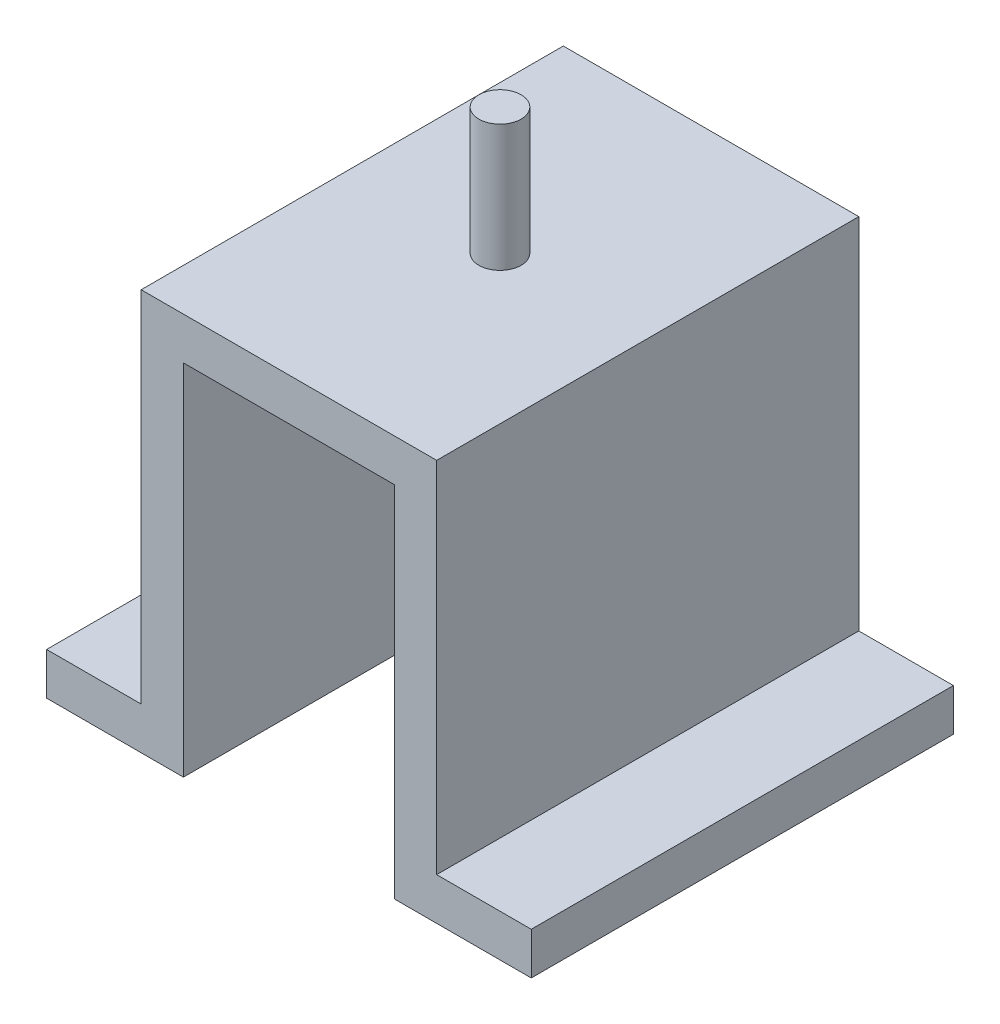
ISO-10303-21;
HEADER;
FILE_DESCRIPTION(('STEP AP214'),'2;1');
FILE_NAME('part.step','',(''),(''),'','','');
FILE_SCHEMA(('AUTOMOTIVE_DESIGN { 1 0 10303 214 1 1 1 1 }'));
ENDSEC;
DATA;
#1=APPLICATION_CONTEXT('core data for automotive mechanical design processes');
#2=APPLICATION_PROTOCOL_DEFINITION('international standard','automotive_design',2000,#1);
#3=PRODUCT_CONTEXT('',#1,'mechanical');
#4=PRODUCT('Part','Part','',(#3));
#5=PRODUCT_RELATED_PRODUCT_CATEGORY('part','',(#4));
#6=PRODUCT_DEFINITION_FORMATION('','',#4);
#7=PRODUCT_DEFINITION_CONTEXT('part definition',#1,'design');
#8=PRODUCT_DEFINITION('design','',#6,#7);
#9=PRODUCT_DEFINITION_SHAPE('','',#8);
#10=(LENGTH_UNIT() NAMED_UNIT(*) SI_UNIT(.MILLI.,.METRE.));
#11=(NAMED_UNIT(*) PLANE_ANGLE_UNIT() SI_UNIT($,.RADIAN.));
#12=(NAMED_UNIT(*) SI_UNIT($,.STERADIAN.) SOLID_ANGLE_UNIT());
#13=UNCERTAINTY_MEASURE_WITH_UNIT(LENGTH_MEASURE(1.E-05),#10,'distance_accuracy_value','');
#14=(GEOMETRIC_REPRESENTATION_CONTEXT(3) GLOBAL_UNCERTAINTY_ASSIGNED_CONTEXT((#13)) GLOBAL_UNIT_ASSIGNED_CONTEXT((#10,
#11,#12)) REPRESENTATION_CONTEXT('',''));
#15=CARTESIAN_POINT('',(0.,0.,0.));
#16=DIRECTION('',(0.,0.,1.));
#17=DIRECTION('',(1.,0.,0.));
#18=AXIS2_PLACEMENT_3D('',#15,#16,#17);
#19=CARTESIAN_POINT('',(0.,49.5144538231221,0.));
#20=DIRECTION('',(0.,1.,0.));
#21=DIRECTION('',(-1.,0.,0.));
#22=AXIS2_PLACEMENT_3D('',#19,#20,#21);
#23=PLANE('',#22);
#24=DIRECTION('',(0.,0.,1.));
#25=VECTOR('',#24,1.);
#26=CARTESIAN_POINT('',(-35.,49.5144538231221,0.));
#27=LINE('',#26,#25);
#28=CARTESIAN_POINT('',(-35.,49.5144538231221,0.));
#29=VERTEX_POINT('',#28);
#30=CARTESIAN_POINT('',(-35.,49.5144538231221,100.));
#31=VERTEX_POINT('',#30);
#32=EDGE_CURVE('E165',#29,#31,#27,.T.);
#33=ORIENTED_EDGE('',*,*,#32,.T.);
#34=DIRECTION('',(1.,0.,0.));
#35=VECTOR('',#34,1.);
#36=CARTESIAN_POINT('',(-35.,49.5144538231221,100.));
#37=LINE('',#36,#35);
#38=CARTESIAN_POINT('',(35.,49.5144538231221,100.));
#39=VERTEX_POINT('',#38);
#40=EDGE_CURVE('E168',#31,#39,#37,.T.);
#41=ORIENTED_EDGE('',*,*,#40,.T.);
#42=DIRECTION('',(0.,0.,-1.));
#43=VECTOR('',#42,1.);
#44=CARTESIAN_POINT('',(35.,49.5144538231221,0.));
#45=LINE('',#44,#43);
#46=CARTESIAN_POINT('',(35.,49.5144538231221,0.));
#47=VERTEX_POINT('',#46);
#48=EDGE_CURVE('E171',#39,#47,#45,.T.);
#49=ORIENTED_EDGE('',*,*,#48,.T.);
#50=DIRECTION('',(-1.,0.,0.));
#51=VECTOR('',#50,1.);
#52=CARTESIAN_POINT('',(-35.,49.5144538231221,0.));
#53=LINE('',#52,#51);
#54=EDGE_CURVE('E174',#47,#29,#53,.T.);
#55=ORIENTED_EDGE('',*,*,#54,.T.);
#56=EDGE_LOOP('',(#33,#41,#49,#55));
#57=FACE_BOUND('',#56,.T.);
#58=CARTESIAN_POINT('',(0.,49.5144538231221,50.));
#59=DIRECTION('',(0.,1.,0.));
#60=DIRECTION('',(-1.,0.,0.));
#61=AXIS2_PLACEMENT_3D('',#58,#59,#60);
#62=CIRCLE('',#61,5.);
#63=CARTESIAN_POINT('',(-5.00000000000003,49.5144538231221,50.));
#64=VERTEX_POINT('',#63);
#65=EDGE_CURVE('E413',#64,#64,#62,.T.);
#66=ORIENTED_EDGE('',*,*,#65,.F.);
#67=EDGE_LOOP('',(#66));
#68=FACE_BOUND('',#67,.T.);
#69=ADVANCED_FACE('F33',(#57,#68),#23,.T.);
#70=CARTESIAN_POINT('',(0.,39.5144538231221,0.));
#71=DIRECTION('',(0.,1.,0.));
#72=DIRECTION('',(-1.,0.,0.));
#73=AXIS2_PLACEMENT_3D('',#70,#71,#72);
#74=PLANE('',#73);
#75=DIRECTION('',(0.,0.,-1.));
#76=VECTOR('',#75,1.);
#77=CARTESIAN_POINT('',(-25.,39.5144538231221,100.));
#78=LINE('',#77,#76);
#79=CARTESIAN_POINT('',(-25.,39.5144538231221,100.));
#80=VERTEX_POINT('',#79);
#81=CARTESIAN_POINT('',(-25.,39.5144538231221,0.));
#82=VERTEX_POINT('',#81);
#83=EDGE_CURVE('E161',#80,#82,#78,.T.);
#84=ORIENTED_EDGE('',*,*,#83,.T.);
#85=DIRECTION('',(-1.,0.,0.));
#86=VECTOR('',#85,1.);
#87=CARTESIAN_POINT('',(-35.,39.5144538231221,0.));
#88=LINE('',#87,#86);
#89=CARTESIAN_POINT('',(25.,39.5144538231221,0.));
#90=VERTEX_POINT('',#89);
#91=EDGE_CURVE('E81',#90,#82,#88,.T.);
#92=ORIENTED_EDGE('',*,*,#91,.F.);
#93=DIRECTION('',(0.,0.,-1.));
#94=VECTOR('',#93,1.);
#95=CARTESIAN_POINT('',(25.,39.5144538231221,100.));
#96=LINE('',#95,#94);
#97=CARTESIAN_POINT('',(25.,39.5144538231221,100.));
#98=VERTEX_POINT('',#97);
#99=EDGE_CURVE('E191',#98,#90,#96,.T.);
#100=ORIENTED_EDGE('',*,*,#99,.F.);
#101=DIRECTION('',(1.,0.,0.));
#102=VECTOR('',#101,1.);
#103=CARTESIAN_POINT('',(-35.,39.5144538231221,100.));
#104=LINE('',#103,#102);
#105=EDGE_CURVE('E37',#80,#98,#104,.T.);
#106=ORIENTED_EDGE('',*,*,#105,.F.);
#107=EDGE_LOOP('',(#84,#92,#100,#106));
#108=FACE_BOUND('',#107,.T.);
#109=ADVANCED_FACE('F259',(#108),#74,.F.);
#110=CARTESIAN_POINT('',(25.,39.5144538231221,100.));
#111=DIRECTION('',(1.,0.,0.));
#112=DIRECTION('',(0.,1.,0.));
#113=AXIS2_PLACEMENT_3D('',#110,#111,#112);
#114=PLANE('',#113);
#115=DIRECTION('',(0.,-1.,0.));
#116=VECTOR('',#115,1.);
#117=CARTESIAN_POINT('',(25.,39.5144538231221,0.));
#118=LINE('',#117,#116);
#119=CARTESIAN_POINT('',(25.,-45.4855461768779,0.));
#120=VERTEX_POINT('',#119);
#121=EDGE_CURVE('E195',#90,#120,#118,.T.);
#122=ORIENTED_EDGE('',*,*,#121,.T.);
#123=DIRECTION('',(0.,0.,-1.));
#124=VECTOR('',#123,1.);
#125=CARTESIAN_POINT('',(25.,-45.4855461768779,100.));
#126=LINE('',#125,#124);
#127=CARTESIAN_POINT('',(25.,-45.4855461768779,100.));
#128=VERTEX_POINT('',#127);
#129=EDGE_CURVE('E11',#128,#120,#126,.T.);
#130=ORIENTED_EDGE('',*,*,#129,.F.);
#131=DIRECTION('',(0.,-1.,0.));
#132=VECTOR('',#131,1.);
#133=CARTESIAN_POINT('',(25.,39.5144538231221,100.));
#134=LINE('',#133,#132);
#135=EDGE_CURVE('E186',#98,#128,#134,.T.);
#136=ORIENTED_EDGE('',*,*,#135,.F.);
#137=ORIENTED_EDGE('',*,*,#99,.T.);
#138=EDGE_LOOP('',(#122,#130,#136,#137));
#139=FACE_BOUND('',#138,.T.);
#140=ADVANCED_FACE('F35',(#139),#114,.F.);
#141=CARTESIAN_POINT('',(57.4040103991189,-45.4855461768779,100.));
#142=DIRECTION('',(0.,1.,0.));
#143=DIRECTION('',(0.,0.,1.));
#144=AXIS2_PLACEMENT_3D('',#141,#142,#143);
#145=PLANE('',#144);
#146=DIRECTION('',(1.,0.,0.));
#147=VECTOR('',#146,1.);
#148=CARTESIAN_POINT('',(57.4040103991189,-45.4855461768779,0.));
#149=LINE('',#148,#147);
#150=CARTESIAN_POINT('',(57.4040103991189,-45.4855461768779,0.));
#151=VERTEX_POINT('',#150);
#152=EDGE_CURVE('E192',#120,#151,#149,.T.);
#153=ORIENTED_EDGE('',*,*,#152,.T.);
#154=DIRECTION('',(0.,0.,-1.));
#155=VECTOR('',#154,1.);
#156=CARTESIAN_POINT('',(57.4040103991189,-45.4855461768779,100.));
#157=LINE('',#156,#155);
#158=CARTESIAN_POINT('',(57.4040103991189,-45.4855461768779,100.));
#159=VERTEX_POINT('',#158);
#160=EDGE_CURVE('E44',#159,#151,#157,.T.);
#161=ORIENTED_EDGE('',*,*,#160,.F.);
#162=DIRECTION('',(1.,0.,0.));
#163=VECTOR('',#162,1.);
#164=CARTESIAN_POINT('',(57.4040103991189,-45.4855461768779,100.));
#165=LINE('',#164,#163);
#166=EDGE_CURVE('E88',#128,#159,#165,.T.);
#167=ORIENTED_EDGE('',*,*,#166,.F.);
#168=ORIENTED_EDGE('',*,*,#129,.T.);
#169=EDGE_LOOP('',(#153,#161,#167,#168));
#170=FACE_BOUND('',#169,.T.);
#171=ADVANCED_FACE('F217',(#170),#145,.F.);
#172=CARTESIAN_POINT('',(57.4040103991189,-35.4855461768779,100.));
#173=DIRECTION('',(-1.,0.,0.));
#174=DIRECTION('',(0.,-1.,0.));
#175=AXIS2_PLACEMENT_3D('',#172,#173,#174);
#176=PLANE('',#175);
#177=DIRECTION('',(0.,1.,0.));
#178=VECTOR('',#177,1.);
#179=CARTESIAN_POINT('',(57.4040103991189,-35.4855461768779,0.));
#180=LINE('',#179,#178);
#181=CARTESIAN_POINT('',(57.4040103991189,-35.4855461768779,0.));
#182=VERTEX_POINT('',#181);
#183=EDGE_CURVE('E194',#151,#182,#180,.T.);
#184=ORIENTED_EDGE('',*,*,#183,.T.);
#185=DIRECTION('',(0.,0.,-1.));
#186=VECTOR('',#185,1.);
#187=CARTESIAN_POINT('',(57.4040103991189,-35.4855461768779,100.));
#188=LINE('',#187,#186);
#189=CARTESIAN_POINT('',(57.4040103991189,-35.4855461768779,100.));
#190=VERTEX_POINT('',#189);
#191=EDGE_CURVE('E225',#190,#182,#188,.T.);
#192=ORIENTED_EDGE('',*,*,#191,.F.);
#193=DIRECTION('',(0.,1.,0.));
#194=VECTOR('',#193,1.);
#195=CARTESIAN_POINT('',(57.4040103991189,-35.4855461768779,100.));
#196=LINE('',#195,#194);
#197=EDGE_CURVE('E185',#159,#190,#196,.T.);
#198=ORIENTED_EDGE('',*,*,#197,.F.);
#199=ORIENTED_EDGE('',*,*,#160,.T.);
#200=EDGE_LOOP('',(#184,#192,#198,#199));
#201=FACE_BOUND('',#200,.T.);
#202=ADVANCED_FACE('F223',(#201),#176,.F.);
#203=CARTESIAN_POINT('',(35.,-35.4855461768779,100.));
#204=DIRECTION('',(0.,-1.,0.));
#205=DIRECTION('',(0.,0.,-1.));
#206=AXIS2_PLACEMENT_3D('',#203,#204,#205);
#207=PLANE('',#206);
#208=DIRECTION('',(-1.,0.,0.));
#209=VECTOR('',#208,1.);
#210=CARTESIAN_POINT('',(35.,-35.4855461768779,0.));
#211=LINE('',#210,#209);
#212=CARTESIAN_POINT('',(35.,-35.4855461768779,0.));
#213=VERTEX_POINT('',#212);
#214=EDGE_CURVE('E73',#182,#213,#211,.T.);
#215=ORIENTED_EDGE('',*,*,#214,.T.);
#216=DIRECTION('',(0.,0.,-1.));
#217=VECTOR('',#216,1.);
#218=CARTESIAN_POINT('',(35.,-35.4855461768779,100.));
#219=LINE('',#218,#217);
#220=CARTESIAN_POINT('',(35.,-35.4855461768779,100.));
#221=VERTEX_POINT('',#220);
#222=EDGE_CURVE('E202',#221,#213,#219,.T.);
#223=ORIENTED_EDGE('',*,*,#222,.F.);
#224=DIRECTION('',(-1.,0.,0.));
#225=VECTOR('',#224,1.);
#226=CARTESIAN_POINT('',(35.,-35.4855461768779,100.));
#227=LINE('',#226,#225);
#228=EDGE_CURVE('E53',#190,#221,#227,.T.);
#229=ORIENTED_EDGE('',*,*,#228,.F.);
#230=ORIENTED_EDGE('',*,*,#191,.T.);
#231=EDGE_LOOP('',(#215,#223,#229,#230));
#232=FACE_BOUND('',#231,.T.);
#233=ADVANCED_FACE('F289',(#232),#207,.F.);
#234=CARTESIAN_POINT('',(35.,39.5144538231221,100.));
#235=DIRECTION('',(-1.,0.,0.));
#236=DIRECTION('',(0.,-1.,0.));
#237=AXIS2_PLACEMENT_3D('',#234,#235,#236);
#238=PLANE('',#237);
#239=DIRECTION('',(0.,1.,0.));
#240=VECTOR('',#239,1.);
#241=CARTESIAN_POINT('',(35.,39.5144538231221,0.));
#242=LINE('',#241,#240);
#243=EDGE_CURVE('E198',#213,#47,#242,.T.);
#244=ORIENTED_EDGE('',*,*,#243,.T.);
#245=ORIENTED_EDGE('',*,*,#48,.F.);
#246=DIRECTION('',(0.,1.,0.));
#247=VECTOR('',#246,1.);
#248=CARTESIAN_POINT('',(35.,39.5144538231221,100.));
#249=LINE('',#248,#247);
#250=EDGE_CURVE('E189',#221,#39,#249,.T.);
#251=ORIENTED_EDGE('',*,*,#250,.F.);
#252=ORIENTED_EDGE('',*,*,#222,.T.);
#253=EDGE_LOOP('',(#244,#245,#251,#252));
#254=FACE_BOUND('',#253,.T.);
#255=ADVANCED_FACE('F232',(#254),#238,.F.);
#256=CARTESIAN_POINT('',(0.,0.,100.));
#257=DIRECTION('',(0.,0.,-1.));
#258=DIRECTION('',(-1.,0.,0.));
#259=AXIS2_PLACEMENT_3D('',#256,#257,#258);
#260=PLANE('',#259);
#261=ORIENTED_EDGE('',*,*,#135,.T.);
#262=ORIENTED_EDGE('',*,*,#166,.T.);
#263=ORIENTED_EDGE('',*,*,#197,.T.);
#264=ORIENTED_EDGE('',*,*,#228,.T.);
#265=ORIENTED_EDGE('',*,*,#250,.T.);
#266=ORIENTED_EDGE('',*,*,#40,.F.);
#267=DIRECTION('',(0.,-1.,0.));
#268=VECTOR('',#267,1.);
#269=CARTESIAN_POINT('',(-35.,49.5144538231221,100.));
#270=LINE('',#269,#268);
#271=CARTESIAN_POINT('',(-35.,-35.4855461768779,100.));
#272=VERTEX_POINT('',#271);
#273=EDGE_CURVE('E183',#31,#272,#270,.T.);
#274=ORIENTED_EDGE('',*,*,#273,.T.);
#275=DIRECTION('',(-1.,0.,0.));
#276=VECTOR('',#275,1.);
#277=CARTESIAN_POINT('',(-35.,-35.4855461768779,100.));
#278=LINE('',#277,#276);
#279=CARTESIAN_POINT('',(-57.4040103991189,-35.4855461768779,100.));
#280=VERTEX_POINT('',#279);
#281=EDGE_CURVE('E151',#272,#280,#278,.T.);
#282=ORIENTED_EDGE('',*,*,#281,.T.);
#283=DIRECTION('',(0.,-1.,0.));
#284=VECTOR('',#283,1.);
#285=CARTESIAN_POINT('',(-57.4040103991189,-35.4855461768779,100.));
#286=LINE('',#285,#284);
#287=CARTESIAN_POINT('',(-57.4040103991189,-45.4855461768779,100.));
#288=VERTEX_POINT('',#287);
#289=EDGE_CURVE('E146',#280,#288,#286,.T.);
#290=ORIENTED_EDGE('',*,*,#289,.T.);
#291=DIRECTION('',(1.,0.,0.));
#292=VECTOR('',#291,1.);
#293=CARTESIAN_POINT('',(-57.4040103991189,-45.4855461768779,100.));
#294=LINE('',#293,#292);
#295=CARTESIAN_POINT('',(-25.,-45.4855461768779,100.));
#296=VERTEX_POINT('',#295);
#297=EDGE_CURVE('E136',#288,#296,#294,.T.);
#298=ORIENTED_EDGE('',*,*,#297,.T.);
#299=DIRECTION('',(0.,1.,0.));
#300=VECTOR('',#299,1.);
#301=CARTESIAN_POINT('',(-25.,39.5144538231221,100.));
#302=LINE('',#301,#300);
#303=EDGE_CURVE('E145',#296,#80,#302,.T.);
#304=ORIENTED_EDGE('',*,*,#303,.T.);
#305=ORIENTED_EDGE('',*,*,#105,.T.);
#306=EDGE_LOOP('',(#261,#262,#263,#264,#265,#266,#274,#282,#290,#298,#304,#305));
#307=FACE_BOUND('',#306,.T.);
#308=ADVANCED_FACE('F149',(#307),#260,.F.);
#309=CARTESIAN_POINT('',(0.,0.,0.));
#310=DIRECTION('',(0.,0.,-1.));
#311=DIRECTION('',(-1.,0.,0.));
#312=AXIS2_PLACEMENT_3D('',#309,#310,#311);
#313=PLANE('',#312);
#314=ORIENTED_EDGE('',*,*,#121,.F.);
#315=ORIENTED_EDGE('',*,*,#91,.T.);
#316=DIRECTION('',(0.,1.,0.));
#317=VECTOR('',#316,1.);
#318=CARTESIAN_POINT('',(-25.,39.5144538231221,0.));
#319=LINE('',#318,#317);
#320=CARTESIAN_POINT('',(-25.,-45.4855461768779,0.));
#321=VERTEX_POINT('',#320);
#322=EDGE_CURVE('E256',#321,#82,#319,.T.);
#323=ORIENTED_EDGE('',*,*,#322,.F.);
#324=DIRECTION('',(1.,0.,0.));
#325=VECTOR('',#324,1.);
#326=CARTESIAN_POINT('',(-57.4040103991189,-45.4855461768779,0.));
#327=LINE('',#326,#325);
#328=CARTESIAN_POINT('',(-57.4040103991189,-45.4855461768779,0.));
#329=VERTEX_POINT('',#328);
#330=EDGE_CURVE('E253',#329,#321,#327,.T.);
#331=ORIENTED_EDGE('',*,*,#330,.F.);
#332=DIRECTION('',(0.,-1.,0.));
#333=VECTOR('',#332,1.);
#334=CARTESIAN_POINT('',(-57.4040103991189,-35.4855461768779,0.));
#335=LINE('',#334,#333);
#336=CARTESIAN_POINT('',(-57.4040103991189,-35.4855461768779,0.));
#337=VERTEX_POINT('',#336);
#338=EDGE_CURVE('E159',#337,#329,#335,.T.);
#339=ORIENTED_EDGE('',*,*,#338,.F.);
#340=DIRECTION('',(-1.,0.,0.));
#341=VECTOR('',#340,1.);
#342=CARTESIAN_POINT('',(-35.,-35.4855461768779,0.));
#343=LINE('',#342,#341);
#344=CARTESIAN_POINT('',(-35.,-35.4855461768779,0.));
#345=VERTEX_POINT('',#344);
#346=EDGE_CURVE('E155',#345,#337,#343,.T.);
#347=ORIENTED_EDGE('',*,*,#346,.F.);
#348=DIRECTION('',(0.,-1.,0.));
#349=VECTOR('',#348,1.);
#350=CARTESIAN_POINT('',(-35.,49.5144538231221,0.));
#351=LINE('',#350,#349);
#352=EDGE_CURVE('E175',#29,#345,#351,.T.);
#353=ORIENTED_EDGE('',*,*,#352,.F.);
#354=ORIENTED_EDGE('',*,*,#54,.F.);
#355=ORIENTED_EDGE('',*,*,#243,.F.);
#356=ORIENTED_EDGE('',*,*,#214,.F.);
#357=ORIENTED_EDGE('',*,*,#183,.F.);
#358=ORIENTED_EDGE('',*,*,#152,.F.);
#359=EDGE_LOOP('',(#314,#315,#323,#331,#339,#347,#353,#354,#355,#356,#357,#358));
#360=FACE_BOUND('',#359,.T.);
#361=ADVANCED_FACE('F226',(#360),#313,.T.);
#362=CARTESIAN_POINT('',(-35.,49.5144538231221,0.));
#363=DIRECTION('',(1.,0.,0.));
#364=DIRECTION('',(0.,1.,0.));
#365=AXIS2_PLACEMENT_3D('',#362,#363,#364);
#366=PLANE('',#365);
#367=ORIENTED_EDGE('',*,*,#352,.T.);
#368=DIRECTION('',(0.,0.,-1.));
#369=VECTOR('',#368,1.);
#370=CARTESIAN_POINT('',(-35.,-35.4855461768779,100.));
#371=LINE('',#370,#369);
#372=EDGE_CURVE('E241',#272,#345,#371,.T.);
#373=ORIENTED_EDGE('',*,*,#372,.F.);
#374=ORIENTED_EDGE('',*,*,#273,.F.);
#375=ORIENTED_EDGE('',*,*,#32,.F.);
#376=EDGE_LOOP('',(#367,#373,#374,#375));
#377=FACE_BOUND('',#376,.T.);
#378=ADVANCED_FACE('F242',(#377),#366,.F.);
#379=CARTESIAN_POINT('',(-57.4040103991189,-35.4855461768779,100.));
#380=DIRECTION('',(1.,0.,0.));
#381=DIRECTION('',(0.,1.,0.));
#382=AXIS2_PLACEMENT_3D('',#379,#380,#381);
#383=PLANE('',#382);
#384=ORIENTED_EDGE('',*,*,#338,.T.);
#385=DIRECTION('',(0.,0.,-1.));
#386=VECTOR('',#385,1.);
#387=CARTESIAN_POINT('',(-57.4040103991189,-45.4855461768779,100.));
#388=LINE('',#387,#386);
#389=EDGE_CURVE('E140',#288,#329,#388,.T.);
#390=ORIENTED_EDGE('',*,*,#389,.F.);
#391=ORIENTED_EDGE('',*,*,#289,.F.);
#392=DIRECTION('',(0.,0.,-1.));
#393=VECTOR('',#392,1.);
#394=CARTESIAN_POINT('',(-57.4040103991189,-35.4855461768779,100.));
#395=LINE('',#394,#393);
#396=EDGE_CURVE('E245',#280,#337,#395,.T.);
#397=ORIENTED_EDGE('',*,*,#396,.T.);
#398=EDGE_LOOP('',(#384,#390,#391,#397));
#399=FACE_BOUND('',#398,.T.);
#400=ADVANCED_FACE('F157',(#399),#383,.F.);
#401=CARTESIAN_POINT('',(-57.4040103991189,-45.4855461768779,100.));
#402=DIRECTION('',(0.,1.,0.));
#403=DIRECTION('',(0.,0.,1.));
#404=AXIS2_PLACEMENT_3D('',#401,#402,#403);
#405=PLANE('',#404);
#406=ORIENTED_EDGE('',*,*,#330,.T.);
#407=DIRECTION('',(0.,0.,-1.));
#408=VECTOR('',#407,1.);
#409=CARTESIAN_POINT('',(-25.,-45.4855461768779,100.));
#410=LINE('',#409,#408);
#411=EDGE_CURVE('E143',#296,#321,#410,.T.);
#412=ORIENTED_EDGE('',*,*,#411,.F.);
#413=ORIENTED_EDGE('',*,*,#297,.F.);
#414=ORIENTED_EDGE('',*,*,#389,.T.);
#415=EDGE_LOOP('',(#406,#412,#413,#414));
#416=FACE_BOUND('',#415,.T.);
#417=ADVANCED_FACE('F138',(#416),#405,.F.);
#418=CARTESIAN_POINT('',(-25.,39.5144538231221,100.));
#419=DIRECTION('',(-1.,0.,0.));
#420=DIRECTION('',(0.,-1.,0.));
#421=AXIS2_PLACEMENT_3D('',#418,#419,#420);
#422=PLANE('',#421);
#423=ORIENTED_EDGE('',*,*,#322,.T.);
#424=ORIENTED_EDGE('',*,*,#83,.F.);
#425=ORIENTED_EDGE('',*,*,#303,.F.);
#426=ORIENTED_EDGE('',*,*,#411,.T.);
#427=EDGE_LOOP('',(#423,#424,#425,#426));
#428=FACE_BOUND('',#427,.T.);
#429=ADVANCED_FACE('F262',(#428),#422,.F.);
#430=CARTESIAN_POINT('',(-35.,-35.4855461768779,100.));
#431=DIRECTION('',(0.,-1.,0.));
#432=DIRECTION('',(0.,0.,-1.));
#433=AXIS2_PLACEMENT_3D('',#430,#431,#432);
#434=PLANE('',#433);
#435=ORIENTED_EDGE('',*,*,#346,.T.);
#436=ORIENTED_EDGE('',*,*,#396,.F.);
#437=ORIENTED_EDGE('',*,*,#281,.F.);
#438=ORIENTED_EDGE('',*,*,#372,.T.);
#439=EDGE_LOOP('',(#435,#436,#437,#438));
#440=FACE_BOUND('',#439,.T.);
#441=ADVANCED_FACE('F247',(#440),#434,.F.);
#442=CARTESIAN_POINT('',(0.,79.5144538231221,50.));
#443=DIRECTION('',(0.,-1.,0.));
#444=DIRECTION('',(1.,0.,0.));
#445=AXIS2_PLACEMENT_3D('',#442,#443,#444);
#446=CYLINDRICAL_SURFACE('',#445,5.);
#447=CARTESIAN_POINT('',(0.,79.5144538231221,50.));
#448=DIRECTION('',(0.,1.,0.));
#449=DIRECTION('',(-1.,0.,0.));
#450=AXIS2_PLACEMENT_3D('',#447,#448,#449);
#451=CIRCLE('',#450,5.);
#452=CARTESIAN_POINT('',(-5.00000000000006,79.5144538231221,50.));
#453=VERTEX_POINT('',#452);
#454=EDGE_CURVE('E254',#453,#453,#451,.T.);
#455=ORIENTED_EDGE('',*,*,#454,.F.);
#456=EDGE_LOOP('',(#455));
#457=FACE_BOUND('',#456,.T.);
#458=ORIENTED_EDGE('',*,*,#65,.T.);
#459=EDGE_LOOP('',(#458));
#460=FACE_BOUND('',#459,.T.);
#461=ADVANCED_FACE('F269',(#457,#460),#446,.T.);
#462=CARTESIAN_POINT('',(0.,79.5144538231221,50.));
#463=DIRECTION('',(0.,1.,0.));
#464=DIRECTION('',(-1.,0.,0.));
#465=AXIS2_PLACEMENT_3D('',#462,#463,#464);
#466=PLANE('',#465);
#467=ORIENTED_EDGE('',*,*,#454,.T.);
#468=EDGE_LOOP('',(#467));
#469=FACE_BOUND('',#468,.T.);
#470=ADVANCED_FACE('F397',(#469),#466,.T.);
#471=CLOSED_SHELL('',(#69,#109,#140,#171,#202,#233,#255,#308,#361,#378,#400,#417,#429,#441,#461,#470));
#472=MANIFOLD_SOLID_BREP('B2',#471);
#473=ADVANCED_BREP_SHAPE_REPRESENTATION('',(#18,#472),#14);
#474=SHAPE_DEFINITION_REPRESENTATION(#9,#473);
ENDSEC;
END-ISO-10303-21;
